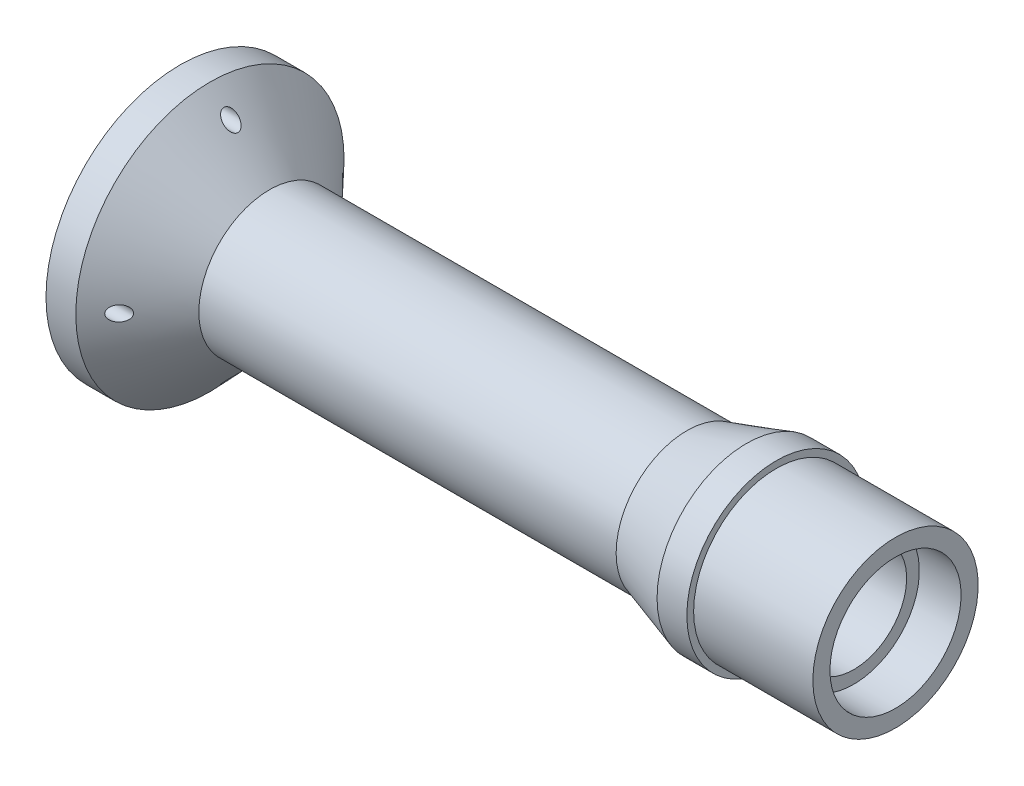
ISO-10303-21;
HEADER;
FILE_DESCRIPTION(('STEP AP214'),'2;1');
FILE_NAME('part.step','',(''),(''),'','','');
FILE_SCHEMA(('AUTOMOTIVE_DESIGN { 1 0 10303 214 1 1 1 1 }'));
ENDSEC;
DATA;
#1=APPLICATION_CONTEXT('core data for automotive mechanical design processes');
#2=APPLICATION_PROTOCOL_DEFINITION('international standard','automotive_design',2000,#1);
#3=PRODUCT_CONTEXT('',#1,'mechanical');
#4=PRODUCT('Part','Part','',(#3));
#5=PRODUCT_RELATED_PRODUCT_CATEGORY('part','',(#4));
#6=PRODUCT_DEFINITION_FORMATION('','',#4);
#7=PRODUCT_DEFINITION_CONTEXT('part definition',#1,'design');
#8=PRODUCT_DEFINITION('design','',#6,#7);
#9=PRODUCT_DEFINITION_SHAPE('','',#8);
#10=(LENGTH_UNIT() NAMED_UNIT(*) SI_UNIT(.MILLI.,.METRE.));
#11=(NAMED_UNIT(*) PLANE_ANGLE_UNIT() SI_UNIT($,.RADIAN.));
#12=(NAMED_UNIT(*) SI_UNIT($,.STERADIAN.) SOLID_ANGLE_UNIT());
#13=UNCERTAINTY_MEASURE_WITH_UNIT(LENGTH_MEASURE(1.E-05),#10,'distance_accuracy_value','');
#14=(GEOMETRIC_REPRESENTATION_CONTEXT(3) GLOBAL_UNCERTAINTY_ASSIGNED_CONTEXT((#13)) GLOBAL_UNIT_ASSIGNED_CONTEXT((#10,
#11,#12)) REPRESENTATION_CONTEXT('',''));
#15=CARTESIAN_POINT('',(0.,0.,0.));
#16=DIRECTION('',(0.,0.,1.));
#17=DIRECTION('',(1.,0.,0.));
#18=AXIS2_PLACEMENT_3D('',#15,#16,#17);
#19=CARTESIAN_POINT('',(98.9157096201432,0.,0.));
#20=DIRECTION('',(-1.,0.,0.));
#21=DIRECTION('',(0.,0.,1.));
#22=AXIS2_PLACEMENT_3D('',#19,#20,#21);
#23=PLANE('',#22);
#24=CARTESIAN_POINT('',(98.9157096201432,0.,0.));
#25=DIRECTION('',(-1.,0.,0.));
#26=DIRECTION('',(0.,0.,1.));
#27=AXIS2_PLACEMENT_3D('',#24,#25,#26);
#28=CIRCLE('',#27,11.);
#29=CARTESIAN_POINT('',(98.9157096201432,0.,11.));
#30=VERTEX_POINT('',#29);
#31=EDGE_CURVE('E10',#30,#30,#28,.T.);
#32=ORIENTED_EDGE('',*,*,#31,.F.);
#33=EDGE_LOOP('',(#32));
#34=FACE_BOUND('',#33,.T.);
#35=CARTESIAN_POINT('',(98.9157096201432,0.,0.));
#36=DIRECTION('',(-1.,0.,0.));
#37=DIRECTION('',(0.,0.,1.));
#38=AXIS2_PLACEMENT_3D('',#35,#36,#37);
#39=CIRCLE('',#38,8.86402754504892);
#40=CARTESIAN_POINT('',(98.9157096201432,0.,8.86402754504892));
#41=VERTEX_POINT('',#40);
#42=EDGE_CURVE('E90',#41,#41,#39,.T.);
#43=ORIENTED_EDGE('',*,*,#42,.T.);
#44=EDGE_LOOP('',(#43));
#45=FACE_BOUND('',#44,.T.);
#46=ADVANCED_FACE('F39',(#34,#45),#23,.F.);
#47=CARTESIAN_POINT('',(0.,0.,0.));
#48=DIRECTION('',(-1.,0.,0.));
#49=DIRECTION('',(0.,0.,1.));
#50=AXIS2_PLACEMENT_3D('',#47,#48,#49);
#51=CYLINDRICAL_SURFACE('',#50,11.);
#52=CARTESIAN_POINT('',(105.915709620143,0.,0.));
#53=DIRECTION('',(-1.,0.,0.));
#54=DIRECTION('',(0.,0.,1.));
#55=AXIS2_PLACEMENT_3D('',#52,#53,#54);
#56=CIRCLE('',#55,11.);
#57=CARTESIAN_POINT('',(105.915709620143,0.,11.));
#58=VERTEX_POINT('',#57);
#59=EDGE_CURVE('E46',#58,#58,#56,.T.);
#60=ORIENTED_EDGE('',*,*,#59,.F.);
#61=EDGE_LOOP('',(#60));
#62=FACE_BOUND('',#61,.T.);
#63=ORIENTED_EDGE('',*,*,#31,.T.);
#64=EDGE_LOOP('',(#63));
#65=FACE_BOUND('',#64,.T.);
#66=ADVANCED_FACE('F135',(#62,#65),#51,.F.);
#67=CARTESIAN_POINT('',(105.915709620143,0.,0.));
#68=DIRECTION('',(1.,0.,0.));
#69=DIRECTION('',(0.,0.,-1.));
#70=AXIS2_PLACEMENT_3D('',#67,#68,#69);
#71=PLANE('',#70);
#72=ORIENTED_EDGE('',*,*,#59,.T.);
#73=EDGE_LOOP('',(#72));
#74=FACE_BOUND('',#73,.T.);
#75=CARTESIAN_POINT('',(105.915709620143,0.,0.));
#76=DIRECTION('',(-1.,0.,0.));
#77=DIRECTION('',(0.,0.,1.));
#78=AXIS2_PLACEMENT_3D('',#75,#76,#77);
#79=CIRCLE('',#78,13.8640275450489);
#80=CARTESIAN_POINT('',(105.915709620143,0.,13.8640275450489));
#81=VERTEX_POINT('',#80);
#82=EDGE_CURVE('E51',#81,#81,#79,.T.);
#83=ORIENTED_EDGE('',*,*,#82,.F.);
#84=EDGE_LOOP('',(#83));
#85=FACE_BOUND('',#84,.T.);
#86=ADVANCED_FACE('F140',(#74,#85),#71,.T.);
#87=CARTESIAN_POINT('',(0.,0.,0.));
#88=DIRECTION('',(-1.,0.,0.));
#89=DIRECTION('',(0.,0.,1.));
#90=AXIS2_PLACEMENT_3D('',#87,#88,#89);
#91=CYLINDRICAL_SURFACE('',#90,13.8640275450489);
#92=ORIENTED_EDGE('',*,*,#82,.T.);
#93=EDGE_LOOP('',(#92));
#94=FACE_BOUND('',#93,.T.);
#95=CARTESIAN_POINT('',(85.9157096201432,0.,0.));
#96=DIRECTION('',(-1.,0.,0.));
#97=DIRECTION('',(0.,0.,1.));
#98=AXIS2_PLACEMENT_3D('',#95,#96,#97);
#99=CIRCLE('',#98,13.8640275450489);
#100=CARTESIAN_POINT('',(85.9157096201432,0.,13.8640275450489));
#101=VERTEX_POINT('',#100);
#102=EDGE_CURVE('E56',#101,#101,#99,.T.);
#103=ORIENTED_EDGE('',*,*,#102,.F.);
#104=EDGE_LOOP('',(#103));
#105=FACE_BOUND('',#104,.T.);
#106=ADVANCED_FACE('F150',(#94,#105),#91,.T.);
#107=CARTESIAN_POINT('',(85.9157096201432,0.,0.));
#108=DIRECTION('',(1.,0.,0.));
#109=DIRECTION('',(0.,0.,-1.));
#110=AXIS2_PLACEMENT_3D('',#107,#108,#109);
#111=PLANE('',#110);
#112=ORIENTED_EDGE('',*,*,#102,.T.);
#113=EDGE_LOOP('',(#112));
#114=FACE_BOUND('',#113,.T.);
#115=CARTESIAN_POINT('',(85.9157096201432,0.,0.));
#116=DIRECTION('',(-1.,0.,0.));
#117=DIRECTION('',(0.,0.,1.));
#118=AXIS2_PLACEMENT_3D('',#115,#116,#117);
#119=CIRCLE('',#118,15.);
#120=CARTESIAN_POINT('',(85.9157096201432,0.,15.));
#121=VERTEX_POINT('',#120);
#122=EDGE_CURVE('E62',#121,#121,#119,.T.);
#123=ORIENTED_EDGE('',*,*,#122,.F.);
#124=EDGE_LOOP('',(#123));
#125=FACE_BOUND('',#124,.T.);
#126=ADVANCED_FACE('F155',(#114,#125),#111,.T.);
#127=CARTESIAN_POINT('',(0.,0.,0.));
#128=DIRECTION('',(-1.,0.,0.));
#129=DIRECTION('',(0.,0.,1.));
#130=AXIS2_PLACEMENT_3D('',#127,#128,#129);
#131=CYLINDRICAL_SURFACE('',#130,15.);
#132=ORIENTED_EDGE('',*,*,#122,.T.);
#133=EDGE_LOOP('',(#132));
#134=FACE_BOUND('',#133,.T.);
#135=CARTESIAN_POINT('',(80.9157096201432,0.,0.));
#136=DIRECTION('',(-1.,0.,0.));
#137=DIRECTION('',(0.,0.,1.));
#138=AXIS2_PLACEMENT_3D('',#135,#136,#137);
#139=CIRCLE('',#138,15.);
#140=CARTESIAN_POINT('',(80.9157096201432,0.,15.));
#141=VERTEX_POINT('',#140);
#142=EDGE_CURVE('E66',#141,#141,#139,.T.);
#143=ORIENTED_EDGE('',*,*,#142,.F.);
#144=EDGE_LOOP('',(#143));
#145=FACE_BOUND('',#144,.T.);
#146=ADVANCED_FACE('F159',(#134,#145),#131,.T.);
#147=CARTESIAN_POINT('',(70.9157096201432,0.,0.));
#148=DIRECTION('',(1.,0.,0.));
#149=DIRECTION('',(0.,0.,-1.));
#150=AXIS2_PLACEMENT_3D('',#147,#148,#149);
#151=CONICAL_SURFACE('',#150,11.8640275450489,0.303884181662816);
#152=ORIENTED_EDGE('',*,*,#142,.T.);
#153=EDGE_LOOP('',(#152));
#154=FACE_BOUND('',#153,.T.);
#155=CARTESIAN_POINT('',(70.9157096201432,0.,0.));
#156=DIRECTION('',(-1.,0.,0.));
#157=DIRECTION('',(0.,0.,1.));
#158=AXIS2_PLACEMENT_3D('',#155,#156,#157);
#159=CIRCLE('',#158,11.8640275450489);
#160=CARTESIAN_POINT('',(70.9157096201432,0.,11.8640275450489));
#161=VERTEX_POINT('',#160);
#162=EDGE_CURVE('E70',#161,#161,#159,.T.);
#163=ORIENTED_EDGE('',*,*,#162,.F.);
#164=EDGE_LOOP('',(#163));
#165=FACE_BOUND('',#164,.T.);
#166=ADVANCED_FACE('F163',(#154,#165),#151,.T.);
#167=CARTESIAN_POINT('',(0.,0.,0.));
#168=DIRECTION('',(-1.,0.,0.));
#169=DIRECTION('',(0.,0.,1.));
#170=AXIS2_PLACEMENT_3D('',#167,#168,#169);
#171=CYLINDRICAL_SURFACE('',#170,11.8640275450489);
#172=ORIENTED_EDGE('',*,*,#162,.T.);
#173=EDGE_LOOP('',(#172));
#174=FACE_BOUND('',#173,.T.);
#175=CARTESIAN_POINT('',(0.915709620143246,0.,0.));
#176=DIRECTION('',(-1.,0.,0.));
#177=DIRECTION('',(0.,0.,1.));
#178=AXIS2_PLACEMENT_3D('',#175,#176,#177);
#179=CIRCLE('',#178,11.8640275450489);
#180=CARTESIAN_POINT('',(0.915709620143246,0.,11.8640275450489));
#181=VERTEX_POINT('',#180);
#182=EDGE_CURVE('E74',#181,#181,#179,.T.);
#183=ORIENTED_EDGE('',*,*,#182,.F.);
#184=EDGE_LOOP('',(#183));
#185=FACE_BOUND('',#184,.T.);
#186=ADVANCED_FACE('F131',(#174,#185),#171,.T.);
#187=CARTESIAN_POINT('',(-9.08429037985676,0.,0.));
#188=DIRECTION('',(-1.,0.,0.));
#189=DIRECTION('',(0.,0.,1.));
#190=AXIS2_PLACEMENT_3D('',#187,#188,#189);
#191=CONICAL_SURFACE('',#190,22.5,0.816207044570471);
#192=CARTESIAN_POINT('',(-6.66026669405461,-0.448506013772635,-19.9167657672429));
#193=CARTESIAN_POINT('',(-6.67678957720332,-0.399920819722906,-19.9354377519761));
#194=CARTESIAN_POINT('',(-6.69086648049991,-0.349383554475213,-19.951370134445));
#195=CARTESIAN_POINT('',(-6.71335214803267,-0.245435439400362,-19.9768370995959));
#196=CARTESIAN_POINT('',(-6.72175418900036,-0.192021261738029,-19.9863640934612));
#197=CARTESIAN_POINT('',(-6.73235907512348,-0.0836453225702933,-19.9983910125147));
#198=CARTESIAN_POINT('',(-6.7345464922428,-0.0286800510916007,-20.0008734493088));
#199=CARTESIAN_POINT('',(-6.73252482926705,0.080957711242832,-19.9985799001736));
#200=CARTESIAN_POINT('',(-6.72831800676304,0.135630298596997,-19.9938064760448));
#201=CARTESIAN_POINT('',(-6.7140449740126,0.241239668863443,-19.9776247333333));
#202=CARTESIAN_POINT('',(-6.70418223649309,0.292240265285566,-19.9664468289563));
#203=CARTESIAN_POINT('',(-6.67931395819534,0.391285961607535,-19.9382967954393));
#204=CARTESIAN_POINT('',(-6.66430689224739,0.439330180024171,-19.9213229479472));
#205=CARTESIAN_POINT('',(-6.62851429912339,0.53523063236525,-19.8809034621569));
#206=CARTESIAN_POINT('',(-6.6073705300564,0.582782519438381,-19.857057600325));
#207=CARTESIAN_POINT('',(-6.56083777831675,0.672949995507108,-19.8046861073147));
#208=CARTESIAN_POINT('',(-6.53544621868369,0.715562561291796,-19.7761576355881));
#209=CARTESIAN_POINT('',(-6.46758162860848,0.815805536946124,-19.7000886827348));
#210=CARTESIAN_POINT('',(-6.42294236028792,0.870203792754329,-19.6502047795563));
#211=CARTESIAN_POINT('',(-6.32817049905753,0.967508355789404,-19.5447330206669));
#212=CARTESIAN_POINT('',(-6.27802540412551,1.01038771384446,-19.4891322025842));
#213=CARTESIAN_POINT('',(-6.15755786845385,1.09690221673963,-19.3561532396313));
#214=CARTESIAN_POINT('',(-6.08585027017429,1.13653210979027,-19.2774264916385));
#215=CARTESIAN_POINT('',(-5.93864072233933,1.19805918408531,-19.1168237523204));
#216=CARTESIAN_POINT('',(-5.86313712830254,1.21994860835788,-19.0349463997739));
#217=CARTESIAN_POINT('',(-5.70893165238426,1.24723231265215,-18.868811272672));
#218=CARTESIAN_POINT('',(-5.63019707521647,1.25233577419882,-18.7845367933967));
#219=CARTESIAN_POINT('',(-5.47241257035594,1.24571601470711,-18.6167856005062));
#220=CARTESIAN_POINT('',(-5.39336237664662,1.23397246393816,-18.5333099733119));
#221=CARTESIAN_POINT('',(-5.22556574385787,1.19065171034467,-18.3573074707136));
#222=CARTESIAN_POINT('',(-5.13704426550028,1.15648480191832,-18.2651875492614));
#223=CARTESIAN_POINT('',(-4.96531918415253,1.06485861592917,-18.0878017561953));
#224=CARTESIAN_POINT('',(-4.88210257067494,1.00745907913359,-18.002518972289));
#225=CARTESIAN_POINT('',(-4.75919823962135,0.897090962341849,-17.8773888791625));
#226=CARTESIAN_POINT('',(-4.71597888007622,0.85250409529283,-17.8335731950748));
#227=CARTESIAN_POINT('',(-4.63462123035421,0.754538862208822,-17.7513777283727));
#228=CARTESIAN_POINT('',(-4.59647423633942,0.701175916811774,-17.7129886267737));
#229=CARTESIAN_POINT('',(-4.53443087499865,0.597473546586185,-17.6507295106562));
#230=CARTESIAN_POINT('',(-4.50921578086035,0.548750366966385,-17.6254959680271));
#231=CARTESIAN_POINT('',(-4.46465420793186,0.446113348641182,-17.5809813715333));
#232=CARTESIAN_POINT('',(-4.44530502792752,0.392201914206481,-17.5616975777764));
#233=CARTESIAN_POINT('',(-4.41374319214079,0.279674709436385,-17.5302779176378));
#234=CARTESIAN_POINT('',(-4.4016015969775,0.22101837188967,-17.5182132163549));
#235=CARTESIAN_POINT('',(-4.38595740931056,0.101465173524916,-17.5026731530686));
#236=CARTESIAN_POINT('',(-4.38244501687314,0.0405709341044393,-17.4991880474596));
#237=CARTESIAN_POINT('',(-4.38425636492349,-0.0715022189011986,-17.5009864543106));
#238=CARTESIAN_POINT('',(-4.38830062624331,-0.122730771847907,-17.5050002531132));
#239=CARTESIAN_POINT('',(-4.40248056721246,-0.223471242693661,-17.5190869525529));
#240=CARTESIAN_POINT('',(-4.41261691027663,-0.272982973013167,-17.5291605130854));
#241=CARTESIAN_POINT('',(-4.43820999091072,-0.368843004441974,-17.5546318293993));
#242=CARTESIAN_POINT('',(-4.45363864569366,-0.415206486179648,-17.5700014842447));
#243=CARTESIAN_POINT('',(-4.48896505855707,-0.504346777605964,-17.6052572831881));
#244=CARTESIAN_POINT('',(-4.50886474168719,-0.547122031416576,-17.6251453727884));
#245=CARTESIAN_POINT('',(-4.56323912118419,-0.649299613786404,-17.679606109507));
#246=CARTESIAN_POINT('',(-4.60000821599986,-0.706232977565863,-17.7165312343461));
#247=CARTESIAN_POINT('',(-4.67936360466072,-0.81103052179373,-17.7965335473346));
#248=CARTESIAN_POINT('',(-4.72196428390377,-0.858871553535243,-17.8396259613499));
#249=CARTESIAN_POINT('',(-4.82788210839871,-0.962022780493676,-17.9472202797889));
#250=CARTESIAN_POINT('',(-4.89298616048833,-1.01342894689954,-18.013699565519));
#251=CARTESIAN_POINT('',(-5.02758962358844,-1.10072625604713,-18.1520036911936));
#252=CARTESIAN_POINT('',(-5.09709225336263,-1.13660588281523,-18.2238324527011));
#253=CARTESIAN_POINT('',(-5.240290114305,-1.19445861675544,-18.3727616700189));
#254=CARTESIAN_POINT('',(-5.314047302,-1.2160477101848,-18.4499504562693));
#255=CARTESIAN_POINT('',(-5.46242691035719,-1.24424381581973,-18.6062414664855));
#256=CARTESIAN_POINT('',(-5.53704981829696,-1.25084193353044,-18.6853447982835));
#257=CARTESIAN_POINT('',(-5.70046827142285,-1.24880241687664,-18.8596784487503));
#258=CARTESIAN_POINT('',(-5.78914512627265,-1.23689017856453,-18.9550013802202));
#259=CARTESIAN_POINT('',(-5.96306306238424,-1.1904578476131,-19.1433142460776));
#260=CARTESIAN_POINT('',(-6.0483077071352,-1.15596188049457,-19.2363065602496));
#261=CARTESIAN_POINT('',(-6.1865993965749,-1.07709738754853,-19.3881602395853));
#262=CARTESIAN_POINT('',(-6.24145456420782,-1.03907576692965,-19.4486871415777));
#263=CARTESIAN_POINT('',(-6.34630420738965,-0.950693499577614,-19.5648578015637));
#264=CARTESIAN_POINT('',(-6.39630329441899,-0.900344722311043,-19.6205061873542));
#265=CARTESIAN_POINT('',(-6.47918690670775,-0.799133439145393,-19.7130819801105));
#266=CARTESIAN_POINT('',(-6.51343779380611,-0.750719130705063,-19.7514596038231));
#267=CARTESIAN_POINT('',(-6.5760956295702,-0.646229841979031,-19.8218309603843));
#268=CARTESIAN_POINT('',(-6.60452393083194,-0.590184154421451,-19.8538480052825));
#269=CARTESIAN_POINT('',(-6.64035429872062,-0.504004530217813,-19.8942715908));
#270=CARTESIAN_POINT('',(-6.65071887204388,-0.47658118570046,-19.9059760772586));
#271=CARTESIAN_POINT('',(-6.66026669405461,-0.448506013772635,-19.9167657672429));
#272=B_SPLINE_CURVE_WITH_KNOTS('',3,(#192,#193,#194,#195,#196,#197,#198,#199,#200,#201,#202,
#203,#204,#205,#206,#207,#208,#209,#210,#211,#212,#213,#214,#215,#216,#217,#218,#219,#220,#221,
#222,#223,#224,#225,#226,#227,#228,#229,#230,#231,#232,#233,#234,#235,#236,#237,#238,#239,#240,
#241,#242,#243,#244,#245,#246,#247,#248,#249,#250,#251,#252,#253,#254,#255,#256,#257,#258,#259,
#260,#261,#262,#263,#264,#265,#266,#267,#268,#269,#270,#271),.UNSPECIFIED.,.T.,.F.,(4,2,2,2,2,2,
2,2,2,2,2,2,2,2,2,2,2,2,2,2,2,2,2,2,2,2,2,2,2,2,2,2,2,2,2,2,2,2,2,4),(0.,0.16374151774707,
0.327676688851818,0.492018481031303,0.656302263125279,0.815016692395234,0.973778217433176,
1.14486894796858,1.31606385115205,1.57339908533545,1.83133122897444,2.17040013705151,
2.50961722222384,2.85468115661716,3.20016183911817,3.59491286858794,3.98865521293025,
4.21597338851963,4.4428963242416,4.62337849285396,4.80377742395034,4.98592660338949,
5.16786882549899,5.32174467065876,5.47563727561023,5.62872559325892,5.78187995148511,
6.01212810300239,6.24295482641709,6.56015706203459,6.87759416374211,7.2032481840493,
7.52909537206592,7.91944665533331,8.30938161697218,8.57879448541462,8.84794895711862,
9.05910937510614,9.26948098447698,9.36409975367994),.UNSPECIFIED.);
#273=CARTESIAN_POINT('',(-6.66026669405461,-0.448506013772635,-19.9167657672429));
#274=VERTEX_POINT('',#273);
#275=EDGE_CURVE('E231',#274,#274,#272,.T.);
#276=ORIENTED_EDGE('',*,*,#275,.F.);
#277=EDGE_LOOP('',(#276));
#278=FACE_BOUND('',#277,.T.);
#279=CARTESIAN_POINT('',(-6.66026669405461,-19.9167657672429,-0.448506013772568));
#280=CARTESIAN_POINT('',(-6.63815032051017,-19.8917728636498,-0.513518335652248));
#281=CARTESIAN_POINT('',(-6.61161347998769,-19.8618285688846,-0.575121393856005));
#282=CARTESIAN_POINT('',(-6.55161019151789,-19.7943054365609,-0.690218965951098));
#283=CARTESIAN_POINT('',(-6.51813113922921,-19.7567127148215,-0.743698420231013));
#284=CARTESIAN_POINT('',(-6.43802315428703,-19.667047155056,-0.852967633929576));
#285=CARTESIAN_POINT('',(-6.39012074492357,-19.6136070182129,-0.90668931852221));
#286=CARTESIAN_POINT('',(-6.28894156117369,-19.5012246485338,-1.00179665716617));
#287=CARTESIAN_POINT('',(-6.23565877912497,-19.4422762708625,-1.0431683128496));
#288=CARTESIAN_POINT('',(-6.10871720680222,-19.3024988216838,-1.12500813052547));
#289=CARTESIAN_POINT('',(-6.03377698175791,-19.2204526546531,-1.16140281183079));
#290=CARTESIAN_POINT('',(-5.88040154799016,-19.053633350674,-1.21573640869465));
#291=CARTESIAN_POINT('',(-5.80196321452887,-18.9688577952438,-1.23365846428824));
#292=CARTESIAN_POINT('',(-5.6423563297203,-18.7975187376542,-1.25211008044992));
#293=CARTESIAN_POINT('',(-5.56116426858893,-18.7109479963342,-1.25236350048569));
#294=CARTESIAN_POINT('',(-5.39905982004801,-18.5393012822814,-1.23513013315618));
#295=CARTESIAN_POINT('',(-5.31814742986183,-18.4542252946739,-1.21764352242844));
#296=CARTESIAN_POINT('',(-5.1641978078002,-18.2934580464827,-1.16648245279256));
#297=CARTESIAN_POINT('',(-5.09100637608686,-18.217527160132,-1.13403000299646));
#298=CARTESIAN_POINT('',(-4.94867569068526,-18.0707722853606,-1.05269855741708));
#299=CARTESIAN_POINT('',(-4.87953125679417,-17.9999417404461,-1.00384112520878));
#300=CARTESIAN_POINT('',(-4.7676106610289,-17.8859294413388,-0.905414157423399));
#301=CARTESIAN_POINT('',(-4.72303825856239,-17.8407211367091,-0.860234510994903));
#302=CARTESIAN_POINT('',(-4.6391347448829,-17.7559240186925,-0.76064190928245));
#303=CARTESIAN_POINT('',(-4.59979545427138,-17.7163264292432,-0.706243672746416));
#304=CARTESIAN_POINT('',(-4.53660467403755,-17.6529072122063,-0.601454880120009));
#305=CARTESIAN_POINT('',(-4.5112592409108,-17.6275399391019,-0.552909633328836));
#306=CARTESIAN_POINT('',(-4.46639271829963,-17.5827155988791,-0.450619293227519));
#307=CARTESIAN_POINT('',(-4.44686846916035,-17.5632553254223,-0.396877041833559));
#308=CARTESIAN_POINT('',(-4.41490567465385,-17.531433889646,-0.284650832003546));
#309=CARTESIAN_POINT('',(-4.40253803350797,-17.5191437561271,-0.226125769307544));
#310=CARTESIAN_POINT('',(-4.38640670373281,-17.503119123831,-0.106768800141264));
#311=CARTESIAN_POINT('',(-4.38263333733101,-17.4993750016194,-0.0459395669158795));
#312=CARTESIAN_POINT('',(-4.3839584239819,-17.5006906817039,0.0662023582852721));
#313=CARTESIAN_POINT('',(-4.38779271409742,-17.5044959870249,0.117552873316154));
#314=CARTESIAN_POINT('',(-4.40159182809436,-17.5182037833195,0.218577417167357));
#315=CARTESIAN_POINT('',(-4.41155728797124,-17.5281069068288,0.268251271501185));
#316=CARTESIAN_POINT('',(-4.43681306365995,-17.5532406850825,0.36429963028754));
#317=CARTESIAN_POINT('',(-4.4520577216106,-17.5684256638246,0.410698445583755));
#318=CARTESIAN_POINT('',(-4.48703138596036,-17.6033257139951,0.499937791664337));
#319=CARTESIAN_POINT('',(-4.50676229745954,-17.623042709996,0.54277680018331));
#320=CARTESIAN_POINT('',(-4.56064574127676,-17.6770043697491,0.644968442635849));
#321=CARTESIAN_POINT('',(-4.59708045754509,-17.7135876268622,0.701888506456444));
#322=CARTESIAN_POINT('',(-4.67577437330171,-17.7929076173787,0.806733008871856));
#323=CARTESIAN_POINT('',(-4.71804792543807,-17.8356595260989,0.854634571143292));
#324=CARTESIAN_POINT('',(-4.82321916828789,-17.9424685575417,0.958017328120186));
#325=CARTESIAN_POINT('',(-4.88791136537632,-18.0085081702007,1.00961797327272));
#326=CARTESIAN_POINT('',(-5.02172345354599,-18.1459550035946,1.09740140758183));
#327=CARTESIAN_POINT('',(-5.09084664364295,-18.2173662306924,1.13357255195465));
#328=CARTESIAN_POINT('',(-5.23332766877022,-18.3654931175994,1.19212238778732));
#329=CARTESIAN_POINT('',(-5.30674895563993,-18.4422986149143,1.21411607920165));
#330=CARTESIAN_POINT('',(-5.45449765533546,-18.5978572128736,1.24322869501921));
#331=CARTESIAN_POINT('',(-5.52882554861625,-18.6766113711653,1.25033935406868));
#332=CARTESIAN_POINT('',(-5.69188680606378,-18.8504804468651,1.24956475865898));
#333=CARTESIAN_POINT('',(-5.780512196807,-18.9457015845187,1.23837741121419));
#334=CARTESIAN_POINT('',(-5.95444471296377,-19.1339395712972,1.19349761656405));
#335=CARTESIAN_POINT('',(-6.03975462522257,-19.2269582448367,1.15982452265849));
#336=CARTESIAN_POINT('',(-6.17874967694287,-19.3795138014526,1.08219656597229));
#337=CARTESIAN_POINT('',(-6.23417540425439,-19.4406448839164,1.04446307513338));
#338=CARTESIAN_POINT('',(-6.34014125036273,-19.5580094084274,0.956545509518683));
#339=CARTESIAN_POINT('',(-6.3906892399403,-19.6142507256319,0.906381975120064));
#340=CARTESIAN_POINT('',(-6.47411426923671,-19.7074057706983,0.805887968248813));
#341=CARTESIAN_POINT('',(-6.50840867571759,-19.7458214549752,0.758132814902342));
#342=CARTESIAN_POINT('',(-6.57136741673149,-19.8165120844713,0.654941988767196));
#343=CARTESIAN_POINT('',(-6.60003834594208,-19.8487942211213,0.599515444002966));
#344=CARTESIAN_POINT('',(-6.64579762481817,-19.9004079992813,0.491913587223219));
#345=CARTESIAN_POINT('',(-6.66403237416933,-19.9210146600345,0.44084149371502));
#346=CARTESIAN_POINT('',(-6.69461596737183,-19.9556113014905,0.334818900040449));
#347=CARTESIAN_POINT('',(-6.70696826342714,-19.9696051629742,0.279870696420644));
#348=CARTESIAN_POINT('',(-6.72504452085424,-19.9900931932632,0.167213243644967));
#349=CARTESIAN_POINT('',(-6.73073483640194,-19.9965492927305,0.109491499031406));
#350=CARTESIAN_POINT('',(-6.73494928864045,-20.0013303263832,-0.0065477820052054));
#351=CARTESIAN_POINT('',(-6.73347452516715,-19.9996565085066,-0.0648652256174555));
#352=CARTESIAN_POINT('',(-6.72354712121815,-19.9883971156262,-0.179245021732268));
#353=CARTESIAN_POINT('',(-6.71519585594832,-19.9789264836726,-0.235327802635304));
#354=CARTESIAN_POINT('',(-6.69222691275231,-19.9529098925401,-0.344475481733902));
#355=CARTESIAN_POINT('',(-6.67760522626191,-19.9363594073589,-0.397538424781667));
#356=CARTESIAN_POINT('',(-6.66026669405461,-19.9167657672429,-0.448506013772568));
#357=B_SPLINE_CURVE_WITH_KNOTS('',3,(#279,#280,#281,#282,#283,#284,#285,#286,#287,#288,#289,
#290,#291,#292,#293,#294,#295,#296,#297,#298,#299,#300,#301,#302,#303,#304,#305,#306,#307,#308,
#309,#310,#311,#312,#313,#314,#315,#316,#317,#318,#319,#320,#321,#322,#323,#324,#325,#326,#327,
#328,#329,#330,#331,#332,#333,#334,#335,#336,#337,#338,#339,#340,#341,#342,#343,#344,#345,#346,
#347,#348,#349,#350,#351,#352,#353,#354,#355,#356),.UNSPECIFIED.,.T.,.F.,(4,2,2,2,2,2,2,2,2,2,2,
2,2,2,2,2,2,2,2,2,2,2,2,2,2,2,2,2,2,2,2,2,2,2,2,2,2,2,4),(0.,0.218955034523404,
0.438311142246842,0.705800713774014,0.97359233499966,1.32253957720317,1.671805022282,
2.02652788187713,2.38124720953019,2.71107575397997,3.04047244060929,3.27350327862225,
3.50616549711315,3.68655690271902,3.86685021546504,4.04890048454634,4.23074565033955,
4.38488380745083,4.53903795624128,4.69189086998109,4.84480881476817,5.07406726207587,
5.3038996339058,5.61981166653562,5.93596170080614,6.26037084914208,6.58496011169364,
6.97480338972996,7.36431156454971,7.63561477741063,7.90647262296364,8.11640854935998,
8.3260967913066,8.49941929850422,8.67263996311462,8.84673174236552,9.0207967994638,
9.19234074165716,9.3639945125797),.UNSPECIFIED.);
#358=CARTESIAN_POINT('',(-6.66026669405461,-19.9167657672429,-0.448506013772568));
#359=VERTEX_POINT('',#358);
#360=EDGE_CURVE('E237',#359,#359,#357,.T.);
#361=ORIENTED_EDGE('',*,*,#360,.F.);
#362=EDGE_LOOP('',(#361));
#363=FACE_BOUND('',#362,.T.);
#364=CARTESIAN_POINT('',(-6.6602666940546,-0.448506013772365,19.9167657672429));
#365=CARTESIAN_POINT('',(-6.63815032051017,-0.513518335652045,19.8917728636498));
#366=CARTESIAN_POINT('',(-6.61161347998768,-0.575121393855803,19.8618285688846));
#367=CARTESIAN_POINT('',(-6.55161019151789,-0.690218965950897,19.7943054365609));
#368=CARTESIAN_POINT('',(-6.5181311392292,-0.743698420230813,19.7567127148215));
#369=CARTESIAN_POINT('',(-6.43802315428703,-0.852967633929376,19.667047155056));
#370=CARTESIAN_POINT('',(-6.39012074492356,-0.906689318522009,19.613607018213));
#371=CARTESIAN_POINT('',(-6.28894156117369,-1.00179665716597,19.5012246485338));
#372=CARTESIAN_POINT('',(-6.23565877912496,-1.0431683128494,19.4422762708625));
#373=CARTESIAN_POINT('',(-6.10871720680221,-1.12500813052527,19.3024988216838));
#374=CARTESIAN_POINT('',(-6.0337769817579,-1.16140281183059,19.2204526546531));
#375=CARTESIAN_POINT('',(-5.88040154799015,-1.21573640869445,19.053633350674));
#376=CARTESIAN_POINT('',(-5.80196321452886,-1.23365846428804,18.9688577952438));
#377=CARTESIAN_POINT('',(-5.64235632972029,-1.25211008044972,18.7975187376542));
#378=CARTESIAN_POINT('',(-5.56116426858892,-1.2523635004855,18.7109479963342));
#379=CARTESIAN_POINT('',(-5.399059820048,-1.23513013315599,18.5393012822814));
#380=CARTESIAN_POINT('',(-5.31814742986183,-1.21764352242825,18.4542252946739));
#381=CARTESIAN_POINT('',(-5.16419780780019,-1.16648245279237,18.2934580464827));
#382=CARTESIAN_POINT('',(-5.09100637608685,-1.13403000299627,18.217527160132));
#383=CARTESIAN_POINT('',(-4.94867569068525,-1.05269855741689,18.0707722853606));
#384=CARTESIAN_POINT('',(-4.87953125679416,-1.00384112520858,17.9999417404461));
#385=CARTESIAN_POINT('',(-4.76761066102889,-0.905414157423204,17.8859294413388));
#386=CARTESIAN_POINT('',(-4.72303825856238,-0.860234510994707,17.8407211367091));
#387=CARTESIAN_POINT('',(-4.63913474488289,-0.760641909282255,17.7559240186925));
#388=CARTESIAN_POINT('',(-4.59979545427138,-0.706243672746222,17.7163264292432));
#389=CARTESIAN_POINT('',(-4.53660467403754,-0.601454880119818,17.6529072122063));
#390=CARTESIAN_POINT('',(-4.51125924091079,-0.552909633328645,17.6275399391019));
#391=CARTESIAN_POINT('',(-4.46639271829962,-0.450619293227328,17.5827155988791));
#392=CARTESIAN_POINT('',(-4.44686846916035,-0.396877041833367,17.5632553254223));
#393=CARTESIAN_POINT('',(-4.41490567465385,-0.284650832003354,17.531433889646));
#394=CARTESIAN_POINT('',(-4.40253803350797,-0.226125769307353,17.5191437561271));
#395=CARTESIAN_POINT('',(-4.38640670373281,-0.106768800141074,17.503119123831));
#396=CARTESIAN_POINT('',(-4.38263333733101,-0.0459395669156891,17.4993750016194));
#397=CARTESIAN_POINT('',(-4.3839584239819,0.066202358285463,17.5006906817039));
#398=CARTESIAN_POINT('',(-4.38779271409742,0.117552873316346,17.5044959870249));
#399=CARTESIAN_POINT('',(-4.40159182809436,0.218577417167548,17.5182037833195));
#400=CARTESIAN_POINT('',(-4.41155728797124,0.268251271501375,17.5281069068288));
#401=CARTESIAN_POINT('',(-4.43681306365995,0.36429963028773,17.5532406850825));
#402=CARTESIAN_POINT('',(-4.45205772161061,0.410698445583945,17.5684256638246));
#403=CARTESIAN_POINT('',(-4.48703138596037,0.499937791664528,17.6033257139951));
#404=CARTESIAN_POINT('',(-4.50676229745954,0.542776800183501,17.623042709996));
#405=CARTESIAN_POINT('',(-4.56064574127677,0.64496844263604,17.677004369749));
#406=CARTESIAN_POINT('',(-4.59708045754509,0.701888506456637,17.7135876268622));
#407=CARTESIAN_POINT('',(-4.67577437330172,0.80673300887205,17.7929076173787));
#408=CARTESIAN_POINT('',(-4.71804792543807,0.854634571143485,17.8356595260989));
#409=CARTESIAN_POINT('',(-4.82321916828789,0.958017328120379,17.9424685575417));
#410=CARTESIAN_POINT('',(-4.88791136537633,1.00961797327291,18.0085081702007));
#411=CARTESIAN_POINT('',(-5.021723453546,1.09740140758202,18.1459550035945));
#412=CARTESIAN_POINT('',(-5.09084664364296,1.13357255195485,18.2173662306924));
#413=CARTESIAN_POINT('',(-5.23332766877023,1.19212238778752,18.3654931175994));
#414=CARTESIAN_POINT('',(-5.30674895563993,1.21411607920184,18.4422986149143));
#415=CARTESIAN_POINT('',(-5.45449765533547,1.24322869501941,18.5978572128736));
#416=CARTESIAN_POINT('',(-5.52882554861627,1.25033935406888,18.6766113711653));
#417=CARTESIAN_POINT('',(-5.69188680606379,1.24956475865918,18.8504804468651));
#418=CARTESIAN_POINT('',(-5.78051219680701,1.23837741121439,18.9457015845187));
#419=CARTESIAN_POINT('',(-5.95444471296378,1.19349761656425,19.1339395712972));
#420=CARTESIAN_POINT('',(-6.03975462522258,1.15982452265868,19.2269582448367));
#421=CARTESIAN_POINT('',(-6.17874967694289,1.08219656597249,19.3795138014526));
#422=CARTESIAN_POINT('',(-6.2341754042544,1.04446307513358,19.4406448839164));
#423=CARTESIAN_POINT('',(-6.34014125036274,0.956545509518878,19.5580094084274));
#424=CARTESIAN_POINT('',(-6.39068923994031,0.90638197512026,19.6142507256319));
#425=CARTESIAN_POINT('',(-6.47411426923672,0.805887968249009,19.7074057706983));
#426=CARTESIAN_POINT('',(-6.5084086757176,0.758132814902537,19.7458214549752));
#427=CARTESIAN_POINT('',(-6.5713674167315,0.65494198876739,19.8165120844713));
#428=CARTESIAN_POINT('',(-6.60003834594208,0.599515444003159,19.8487942211213));
#429=CARTESIAN_POINT('',(-6.64579762481817,0.491913587223413,19.9004079992813));
#430=CARTESIAN_POINT('',(-6.66403237416933,0.440841493715214,19.9210146600345));
#431=CARTESIAN_POINT('',(-6.69461596737184,0.334818900040643,19.9556113014905));
#432=CARTESIAN_POINT('',(-6.70696826342715,0.279870696420839,19.9696051629742));
#433=CARTESIAN_POINT('',(-6.72504452085425,0.167213243645163,19.9900931932632));
#434=CARTESIAN_POINT('',(-6.73073483640194,0.109491499031603,19.9965492927305));
#435=CARTESIAN_POINT('',(-6.73494928864045,-0.00654778200500826,20.0013303263832));
#436=CARTESIAN_POINT('',(-6.73347452516715,-0.0648652256172582,19.9996565085066));
#437=CARTESIAN_POINT('',(-6.72354712121815,-0.17924502173207,19.9883971156262));
#438=CARTESIAN_POINT('',(-6.71519585594832,-0.235327802635105,19.9789264836726));
#439=CARTESIAN_POINT('',(-6.6922269127523,-0.344475481733702,19.9529098925401));
#440=CARTESIAN_POINT('',(-6.6776052262619,-0.397538424781466,19.9363594073589));
#441=CARTESIAN_POINT('',(-6.6602666940546,-0.448506013772365,19.9167657672429));
#442=B_SPLINE_CURVE_WITH_KNOTS('',3,(#364,#365,#366,#367,#368,#369,#370,#371,#372,#373,#374,
#375,#376,#377,#378,#379,#380,#381,#382,#383,#384,#385,#386,#387,#388,#389,#390,#391,#392,#393,
#394,#395,#396,#397,#398,#399,#400,#401,#402,#403,#404,#405,#406,#407,#408,#409,#410,#411,#412,
#413,#414,#415,#416,#417,#418,#419,#420,#421,#422,#423,#424,#425,#426,#427,#428,#429,#430,#431,
#432,#433,#434,#435,#436,#437,#438,#439,#440,#441),.UNSPECIFIED.,.T.,.F.,(4,2,2,2,2,2,2,2,2,2,2,
2,2,2,2,2,2,2,2,2,2,2,2,2,2,2,2,2,2,2,2,2,2,2,2,2,2,2,4),(0.,0.218955034523404,
0.438311142246845,0.705800713774017,0.973592334999662,1.32253957720318,1.671805022282,
2.02652788187713,2.38124720953019,2.71107575397998,3.0404724406093,3.27350327862225,
3.50616549711315,3.68655690271902,3.86685021546504,4.04890048454634,4.23074565033955,
4.38488380745083,4.53903795624128,4.69189086998109,4.84480881476817,5.07406726207588,
5.30389963390581,5.61981166653562,5.93596170080614,6.26037084914209,6.58496011169365,
6.97480338972998,7.36431156454973,7.63561477741064,7.90647262296365,8.11640854936,
8.32609679130661,8.49941929850423,8.67263996311463,8.84673174236553,9.02079679946381,
9.19234074165717,9.36399451257971),.UNSPECIFIED.);
#443=CARTESIAN_POINT('',(-6.6602666940546,-0.448506013772365,19.9167657672429));
#444=VERTEX_POINT('',#443);
#445=EDGE_CURVE('E244',#444,#444,#442,.T.);
#446=ORIENTED_EDGE('',*,*,#445,.F.);
#447=EDGE_LOOP('',(#446));
#448=FACE_BOUND('',#447,.T.);
#449=CARTESIAN_POINT('',(-6.66026669405461,19.9167657672429,-0.448506013772568));
#450=CARTESIAN_POINT('',(-6.67678957720333,19.9354377519761,-0.399920819722839));
#451=CARTESIAN_POINT('',(-6.69086648049991,19.951370134445,-0.349383554475145));
#452=CARTESIAN_POINT('',(-6.71335214803266,19.9768370995959,-0.245435439400293));
#453=CARTESIAN_POINT('',(-6.72175418900036,19.9863640934612,-0.19202126173796));
#454=CARTESIAN_POINT('',(-6.73235907512348,19.9983910125147,-0.0836453225702241));
#455=CARTESIAN_POINT('',(-6.7345464922428,20.0008734493088,-0.0286800510915314));
#456=CARTESIAN_POINT('',(-6.73252482926705,19.9985799001736,0.0809577112429015));
#457=CARTESIAN_POINT('',(-6.72831800676305,19.9938064760448,0.135630298597067));
#458=CARTESIAN_POINT('',(-6.71404497401259,19.9776247333333,0.241239668863512));
#459=CARTESIAN_POINT('',(-6.70418223649309,19.9664468289563,0.292240265285635));
#460=CARTESIAN_POINT('',(-6.67931395819534,19.9382967954393,0.391285961607604));
#461=CARTESIAN_POINT('',(-6.66430689224739,19.9213229479472,0.439330180024241));
#462=CARTESIAN_POINT('',(-6.62851429912339,19.8809034621569,0.535230632365318));
#463=CARTESIAN_POINT('',(-6.6073705300564,19.857057600325,0.582782519438448));
#464=CARTESIAN_POINT('',(-6.56083777831675,19.8046861073147,0.672949995507175));
#465=CARTESIAN_POINT('',(-6.53544621868369,19.7761576355881,0.715562561291864));
#466=CARTESIAN_POINT('',(-6.46758162860848,19.7000886827348,0.815805536946192));
#467=CARTESIAN_POINT('',(-6.42294236028792,19.6502047795563,0.870203792754395));
#468=CARTESIAN_POINT('',(-6.32817049905753,19.5447330206669,0.967508355789468));
#469=CARTESIAN_POINT('',(-6.27802540412551,19.4891322025842,1.01038771384452));
#470=CARTESIAN_POINT('',(-6.15755786845386,19.3561532396313,1.09690221673969));
#471=CARTESIAN_POINT('',(-6.08585027017429,19.2774264916385,1.13653210979034));
#472=CARTESIAN_POINT('',(-5.93864072233934,19.1168237523204,1.19805918408537));
#473=CARTESIAN_POINT('',(-5.86313712830254,19.0349463997739,1.21994860835794));
#474=CARTESIAN_POINT('',(-5.70893165238426,18.868811272672,1.24723231265221));
#475=CARTESIAN_POINT('',(-5.63019707521648,18.7845367933967,1.25233577419888));
#476=CARTESIAN_POINT('',(-5.47241257035595,18.6167856005062,1.24571601470718));
#477=CARTESIAN_POINT('',(-5.39336237664662,18.5333099733119,1.23397246393822));
#478=CARTESIAN_POINT('',(-5.22556574385788,18.3573074707136,1.19065171034473));
#479=CARTESIAN_POINT('',(-5.13704426550029,18.2651875492614,1.15648480191838));
#480=CARTESIAN_POINT('',(-4.96531918415254,18.0878017561953,1.06485861592923));
#481=CARTESIAN_POINT('',(-4.88210257067494,18.002518972289,1.00745907913366));
#482=CARTESIAN_POINT('',(-4.75919823962135,17.8773888791625,0.897090962341915));
#483=CARTESIAN_POINT('',(-4.71597888007622,17.8335731950748,0.852504095292895));
#484=CARTESIAN_POINT('',(-4.63462123035421,17.7513777283727,0.754538862208886));
#485=CARTESIAN_POINT('',(-4.59647423633942,17.7129886267737,0.701175916811839));
#486=CARTESIAN_POINT('',(-4.53443087499865,17.6507295106562,0.597473546586251));
#487=CARTESIAN_POINT('',(-4.50921578086035,17.6254959680271,0.54875036696645));
#488=CARTESIAN_POINT('',(-4.46465420793186,17.5809813715333,0.446113348641247));
#489=CARTESIAN_POINT('',(-4.44530502792752,17.5616975777764,0.392201914206547));
#490=CARTESIAN_POINT('',(-4.41374319214079,17.5302779176378,0.279674709436451));
#491=CARTESIAN_POINT('',(-4.4016015969775,17.5182132163549,0.221018371889736));
#492=CARTESIAN_POINT('',(-4.38595740931056,17.5026731530686,0.101465173524982));
#493=CARTESIAN_POINT('',(-4.38244501687314,17.4991880474596,0.0405709341045054));
#494=CARTESIAN_POINT('',(-4.38425636492349,17.5009864543106,-0.0715022189011323));
#495=CARTESIAN_POINT('',(-4.38830062624331,17.5050002531132,-0.122730771847841));
#496=CARTESIAN_POINT('',(-4.40248056721246,17.5190869525529,-0.223471242693595));
#497=CARTESIAN_POINT('',(-4.41261691027663,17.5291605130854,-0.272982973013101));
#498=CARTESIAN_POINT('',(-4.43820999091072,17.5546318293993,-0.368843004441909));
#499=CARTESIAN_POINT('',(-4.45363864569366,17.5700014842447,-0.415206486179582));
#500=CARTESIAN_POINT('',(-4.48896505855707,17.6052572831881,-0.504346777605899));
#501=CARTESIAN_POINT('',(-4.50886474168719,17.6251453727884,-0.54712203141651));
#502=CARTESIAN_POINT('',(-4.56323912118419,17.679606109507,-0.649299613786339));
#503=CARTESIAN_POINT('',(-4.60000821599986,17.7165312343461,-0.706232977565799));
#504=CARTESIAN_POINT('',(-4.67936360466072,17.7965335473346,-0.811030521793666));
#505=CARTESIAN_POINT('',(-4.72196428390376,17.8396259613499,-0.858871553535178));
#506=CARTESIAN_POINT('',(-4.82788210839871,17.9472202797889,-0.96202278049361));
#507=CARTESIAN_POINT('',(-4.89298616048833,18.013699565519,-1.01342894689948));
#508=CARTESIAN_POINT('',(-5.02758962358844,18.1520036911936,-1.10072625604706));
#509=CARTESIAN_POINT('',(-5.09709225336263,18.2238324527011,-1.13660588281516));
#510=CARTESIAN_POINT('',(-5.240290114305,18.3727616700189,-1.19445861675538));
#511=CARTESIAN_POINT('',(-5.31404730199999,18.4499504562693,-1.21604771018473));
#512=CARTESIAN_POINT('',(-5.46242691035719,18.6062414664855,-1.24424381581966));
#513=CARTESIAN_POINT('',(-5.53704981829696,18.6853447982835,-1.25084193353038));
#514=CARTESIAN_POINT('',(-5.70046827142284,18.8596784487503,-1.24880241687657));
#515=CARTESIAN_POINT('',(-5.78914512627265,18.9550013802202,-1.23689017856446));
#516=CARTESIAN_POINT('',(-5.96306306238423,19.1433142460776,-1.19045784761304));
#517=CARTESIAN_POINT('',(-6.04830770713519,19.2363065602496,-1.15596188049451));
#518=CARTESIAN_POINT('',(-6.1865993965749,19.3881602395853,-1.07709738754846));
#519=CARTESIAN_POINT('',(-6.24145456420781,19.4486871415777,-1.03907576692959));
#520=CARTESIAN_POINT('',(-6.34630420738964,19.5648578015637,-0.950693499577547));
#521=CARTESIAN_POINT('',(-6.39630329441898,19.6205061873542,-0.900344722310979));
#522=CARTESIAN_POINT('',(-6.47918690670775,19.7130819801105,-0.79913343914533));
#523=CARTESIAN_POINT('',(-6.51343779380612,19.7514596038231,-0.750719130704999));
#524=CARTESIAN_POINT('',(-6.5760956295702,19.8218309603843,-0.646229841978966));
#525=CARTESIAN_POINT('',(-6.60452393083193,19.8538480052825,-0.590184154421385));
#526=CARTESIAN_POINT('',(-6.64035429872062,19.8942715908,-0.504004530217747));
#527=CARTESIAN_POINT('',(-6.65071887204388,19.9059760772586,-0.476581185700393));
#528=CARTESIAN_POINT('',(-6.66026669405461,19.9167657672429,-0.448506013772568));
#529=B_SPLINE_CURVE_WITH_KNOTS('',3,(#449,#450,#451,#452,#453,#454,#455,#456,#457,#458,#459,
#460,#461,#462,#463,#464,#465,#466,#467,#468,#469,#470,#471,#472,#473,#474,#475,#476,#477,#478,
#479,#480,#481,#482,#483,#484,#485,#486,#487,#488,#489,#490,#491,#492,#493,#494,#495,#496,#497,
#498,#499,#500,#501,#502,#503,#504,#505,#506,#507,#508,#509,#510,#511,#512,#513,#514,#515,#516,
#517,#518,#519,#520,#521,#522,#523,#524,#525,#526,#527,#528),.UNSPECIFIED.,.T.,.F.,(4,2,2,2,2,2,
2,2,2,2,2,2,2,2,2,2,2,2,2,2,2,2,2,2,2,2,2,2,2,2,2,2,2,2,2,2,2,2,2,4),(0.,0.16374151774707,
0.327676688851819,0.492018481031304,0.65630226312528,0.815016692395235,0.973778217433178,
1.14486894796858,1.31606385115205,1.57339908533545,1.83133122897443,2.1704001370515,
2.50961722222383,2.85468115661715,3.20016183911817,3.59491286858793,3.98865521293024,
4.21597338851963,4.4428963242416,4.62337849285396,4.80377742395034,4.98592660338949,
5.16786882549899,5.32174467065875,5.47563727561023,5.62872559325892,5.78187995148511,
6.01212810300239,6.24295482641709,6.56015706203459,6.87759416374211,7.20324818404929,
7.52909537206592,7.91944665533331,8.30938161697217,8.57879448541462,8.84794895711861,
9.05910937510614,9.26948098447698,9.36409975367994),.UNSPECIFIED.);
#530=CARTESIAN_POINT('',(-6.66026669405461,19.9167657672429,-0.448506013772568));
#531=VERTEX_POINT('',#530);
#532=EDGE_CURVE('E94',#531,#531,#529,.T.);
#533=ORIENTED_EDGE('',*,*,#532,.F.);
#534=EDGE_LOOP('',(#533));
#535=FACE_BOUND('',#534,.T.);
#536=ORIENTED_EDGE('',*,*,#182,.T.);
#537=EDGE_LOOP('',(#536));
#538=FACE_BOUND('',#537,.T.);
#539=CARTESIAN_POINT('',(-9.08429037985676,0.,0.));
#540=DIRECTION('',(-1.,0.,0.));
#541=DIRECTION('',(0.,0.,1.));
#542=AXIS2_PLACEMENT_3D('',#539,#540,#541);
#543=CIRCLE('',#542,22.5);
#544=CARTESIAN_POINT('',(-9.08429037985676,0.,22.5));
#545=VERTEX_POINT('',#544);
#546=EDGE_CURVE('E78',#545,#545,#543,.T.);
#547=ORIENTED_EDGE('',*,*,#546,.F.);
#548=EDGE_LOOP('',(#547));
#549=FACE_BOUND('',#548,.T.);
#550=ADVANCED_FACE('F105',(#278,#363,#448,#535,#538,#549),#191,.T.);
#551=CARTESIAN_POINT('',(0.,0.,0.));
#552=DIRECTION('',(-1.,0.,0.));
#553=DIRECTION('',(0.,0.,1.));
#554=AXIS2_PLACEMENT_3D('',#551,#552,#553);
#555=CYLINDRICAL_SURFACE('',#554,22.5);
#556=ORIENTED_EDGE('',*,*,#546,.T.);
#557=EDGE_LOOP('',(#556));
#558=FACE_BOUND('',#557,.T.);
#559=CARTESIAN_POINT('',(-14.0842903798568,0.,0.));
#560=DIRECTION('',(-1.,0.,0.));
#561=DIRECTION('',(0.,0.,1.));
#562=AXIS2_PLACEMENT_3D('',#559,#560,#561);
#563=CIRCLE('',#562,22.5);
#564=CARTESIAN_POINT('',(-14.0842903798568,0.,22.5));
#565=VERTEX_POINT('',#564);
#566=EDGE_CURVE('E82',#565,#565,#563,.T.);
#567=ORIENTED_EDGE('',*,*,#566,.F.);
#568=EDGE_LOOP('',(#567));
#569=FACE_BOUND('',#568,.T.);
#570=ADVANCED_FACE('F124',(#558,#569),#555,.T.);
#571=CARTESIAN_POINT('',(-14.0842903798568,0.,0.));
#572=DIRECTION('',(-1.,0.,0.));
#573=DIRECTION('',(0.,0.,1.));
#574=AXIS2_PLACEMENT_3D('',#571,#572,#573);
#575=PLANE('',#574);
#576=CARTESIAN_POINT('',(-14.0842903798568,0.,-18.75));
#577=DIRECTION('',(-1.,0.,0.));
#578=DIRECTION('',(0.,1.,0.));
#579=AXIS2_PLACEMENT_3D('',#576,#577,#578);
#580=CIRCLE('',#579,1.25);
#581=CARTESIAN_POINT('',(-14.0842903798568,1.24999999999994,-18.75));
#582=VERTEX_POINT('',#581);
#583=EDGE_CURVE('E251',#582,#582,#580,.T.);
#584=ORIENTED_EDGE('',*,*,#583,.F.);
#585=EDGE_LOOP('',(#584));
#586=FACE_BOUND('',#585,.T.);
#587=CARTESIAN_POINT('',(-14.0842903798568,-18.75,0.));
#588=DIRECTION('',(-1.,0.,0.));
#589=DIRECTION('',(0.,0.,-1.));
#590=AXIS2_PLACEMENT_3D('',#587,#588,#589);
#591=CIRCLE('',#590,1.25);
#592=CARTESIAN_POINT('',(-14.0842903798568,-18.75,-1.25));
#593=VERTEX_POINT('',#592);
#594=EDGE_CURVE('E256',#593,#593,#591,.T.);
#595=ORIENTED_EDGE('',*,*,#594,.F.);
#596=EDGE_LOOP('',(#595));
#597=FACE_BOUND('',#596,.T.);
#598=CARTESIAN_POINT('',(-14.0842903798568,1.96395825309926E-13,18.75));
#599=DIRECTION('',(-1.,0.,0.));
#600=DIRECTION('',(0.,-1.,0.));
#601=AXIS2_PLACEMENT_3D('',#598,#599,#600);
#602=CIRCLE('',#601,1.25);
#603=CARTESIAN_POINT('',(-14.0842903798568,-1.2499999999998,18.75));
#604=VERTEX_POINT('',#603);
#605=EDGE_CURVE('E252',#604,#604,#602,.T.);
#606=ORIENTED_EDGE('',*,*,#605,.F.);
#607=EDGE_LOOP('',(#606));
#608=FACE_BOUND('',#607,.T.);
#609=CARTESIAN_POINT('',(-14.0842903798568,18.75,0.));
#610=DIRECTION('',(-1.,0.,0.));
#611=DIRECTION('',(0.,0.,1.));
#612=AXIS2_PLACEMENT_3D('',#609,#610,#611);
#613=CIRCLE('',#612,1.25);
#614=CARTESIAN_POINT('',(-14.0842903798568,18.75,1.25));
#615=VERTEX_POINT('',#614);
#616=EDGE_CURVE('E103',#615,#615,#613,.T.);
#617=ORIENTED_EDGE('',*,*,#616,.F.);
#618=EDGE_LOOP('',(#617));
#619=FACE_BOUND('',#618,.T.);
#620=ORIENTED_EDGE('',*,*,#566,.T.);
#621=EDGE_LOOP('',(#620));
#622=FACE_BOUND('',#621,.T.);
#623=CARTESIAN_POINT('',(-14.0842903798568,0.,0.));
#624=DIRECTION('',(-1.,0.,0.));
#625=DIRECTION('',(0.,0.,1.));
#626=AXIS2_PLACEMENT_3D('',#623,#624,#625);
#627=CIRCLE('',#626,8.86402754504892);
#628=CARTESIAN_POINT('',(-14.0842903798568,0.,8.86402754504892));
#629=VERTEX_POINT('',#628);
#630=EDGE_CURVE('E86',#629,#629,#627,.T.);
#631=ORIENTED_EDGE('',*,*,#630,.F.);
#632=EDGE_LOOP('',(#631));
#633=FACE_BOUND('',#632,.T.);
#634=ADVANCED_FACE('F121',(#586,#597,#608,#619,#622,#633),#575,.T.);
#635=CARTESIAN_POINT('',(0.,0.,0.));
#636=DIRECTION('',(-1.,0.,0.));
#637=DIRECTION('',(0.,0.,1.));
#638=AXIS2_PLACEMENT_3D('',#635,#636,#637);
#639=CYLINDRICAL_SURFACE('',#638,8.86402754504892);
#640=ORIENTED_EDGE('',*,*,#42,.F.);
#641=EDGE_LOOP('',(#640));
#642=FACE_BOUND('',#641,.T.);
#643=ORIENTED_EDGE('',*,*,#630,.T.);
#644=EDGE_LOOP('',(#643));
#645=FACE_BOUND('',#644,.T.);
#646=ADVANCED_FACE('F115',(#642,#645),#639,.F.);
#647=CARTESIAN_POINT('',(1.91570962014324,18.75,0.));
#648=DIRECTION('',(-1.,0.,0.));
#649=DIRECTION('',(0.,0.,1.));
#650=AXIS2_PLACEMENT_3D('',#647,#648,#649);
#651=CYLINDRICAL_SURFACE('',#650,1.25);
#652=ORIENTED_EDGE('',*,*,#532,.T.);
#653=EDGE_LOOP('',(#652));
#654=FACE_BOUND('',#653,.T.);
#655=ORIENTED_EDGE('',*,*,#616,.T.);
#656=EDGE_LOOP('',(#655));
#657=FACE_BOUND('',#656,.T.);
#658=ADVANCED_FACE('F109',(#654,#657),#651,.F.);
#659=CARTESIAN_POINT('',(1.91570962014324,1.96395825309926E-13,18.75));
#660=DIRECTION('',(-1.,0.,0.));
#661=DIRECTION('',(0.,0.,1.));
#662=AXIS2_PLACEMENT_3D('',#659,#660,#661);
#663=CYLINDRICAL_SURFACE('',#662,1.25);
#664=ORIENTED_EDGE('',*,*,#445,.T.);
#665=EDGE_LOOP('',(#664));
#666=FACE_BOUND('',#665,.T.);
#667=ORIENTED_EDGE('',*,*,#605,.T.);
#668=EDGE_LOOP('',(#667));
#669=FACE_BOUND('',#668,.T.);
#670=ADVANCED_FACE('F114',(#666,#669),#663,.F.);
#671=CARTESIAN_POINT('',(1.91570962014324,-18.75,0.));
#672=DIRECTION('',(-1.,0.,0.));
#673=DIRECTION('',(0.,0.,1.));
#674=AXIS2_PLACEMENT_3D('',#671,#672,#673);
#675=CYLINDRICAL_SURFACE('',#674,1.25);
#676=ORIENTED_EDGE('',*,*,#360,.T.);
#677=EDGE_LOOP('',(#676));
#678=FACE_BOUND('',#677,.T.);
#679=ORIENTED_EDGE('',*,*,#594,.T.);
#680=EDGE_LOOP('',(#679));
#681=FACE_BOUND('',#680,.T.);
#682=ADVANCED_FACE('F205',(#678,#681),#675,.F.);
#683=CARTESIAN_POINT('',(1.91570962014324,0.,-18.75));
#684=DIRECTION('',(-1.,0.,0.));
#685=DIRECTION('',(0.,0.,1.));
#686=AXIS2_PLACEMENT_3D('',#683,#684,#685);
#687=CYLINDRICAL_SURFACE('',#686,1.25);
#688=ORIENTED_EDGE('',*,*,#275,.T.);
#689=EDGE_LOOP('',(#688));
#690=FACE_BOUND('',#689,.T.);
#691=ORIENTED_EDGE('',*,*,#583,.T.);
#692=EDGE_LOOP('',(#691));
#693=FACE_BOUND('',#692,.T.);
#694=ADVANCED_FACE('F214',(#690,#693),#687,.F.);
#695=CLOSED_SHELL('',(#46,#66,#86,#106,#126,#146,#166,#186,#550,#570,#634,#646,#658,#670,#682,#694));
#696=MANIFOLD_SOLID_BREP('B2',#695);
#697=ADVANCED_BREP_SHAPE_REPRESENTATION('',(#18,#696),#14);
#698=SHAPE_DEFINITION_REPRESENTATION(#9,#697);
ENDSEC;
END-ISO-10303-21;
